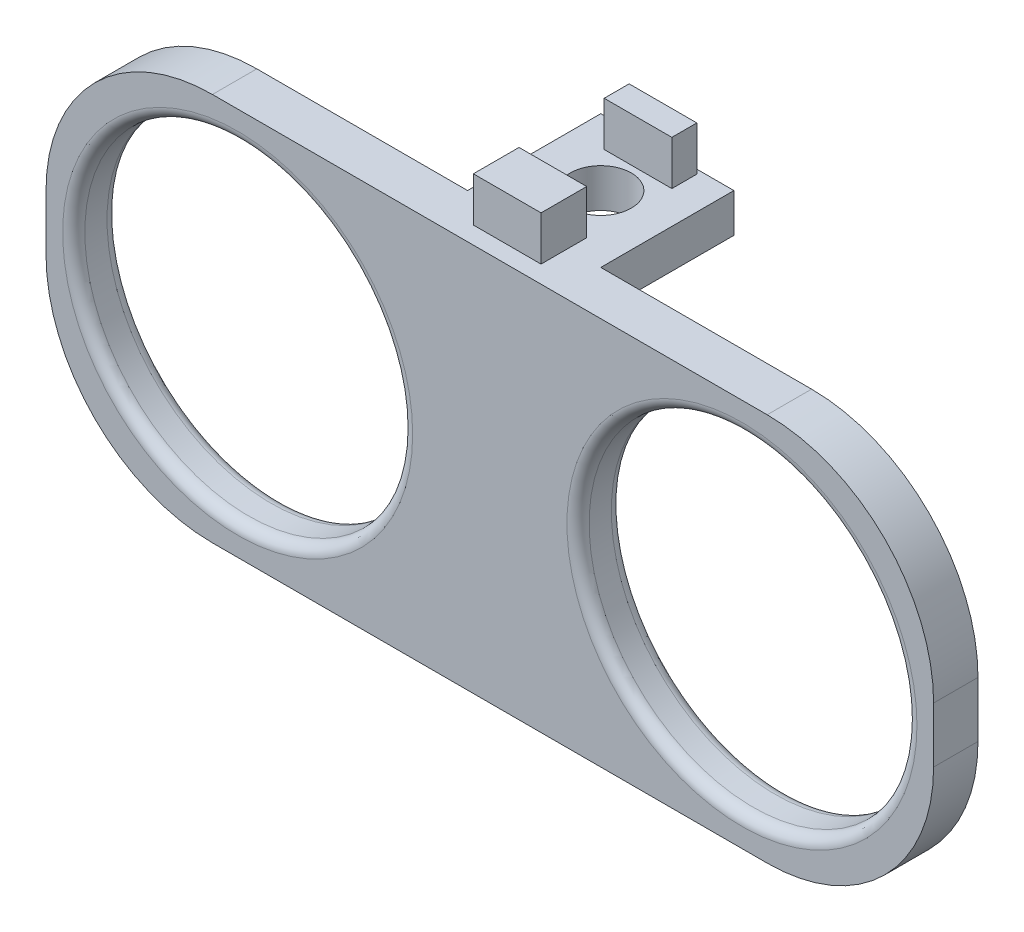
ISO-10303-21;
HEADER;
FILE_DESCRIPTION(('STEP AP214'),'2;1');
FILE_NAME('part.step','',(''),(''),'','','');
FILE_SCHEMA(('AUTOMOTIVE_DESIGN { 1 0 10303 214 1 1 1 1 }'));
ENDSEC;
DATA;
#1=APPLICATION_CONTEXT('core data for automotive mechanical design processes');
#2=APPLICATION_PROTOCOL_DEFINITION('international standard','automotive_design',2000,#1);
#3=PRODUCT_CONTEXT('',#1,'mechanical');
#4=PRODUCT('Part','Part','',(#3));
#5=PRODUCT_RELATED_PRODUCT_CATEGORY('part','',(#4));
#6=PRODUCT_DEFINITION_FORMATION('','',#4);
#7=PRODUCT_DEFINITION_CONTEXT('part definition',#1,'design');
#8=PRODUCT_DEFINITION('design','',#6,#7);
#9=PRODUCT_DEFINITION_SHAPE('','',#8);
#10=(LENGTH_UNIT() NAMED_UNIT(*) SI_UNIT(.MILLI.,.METRE.));
#11=(NAMED_UNIT(*) PLANE_ANGLE_UNIT() SI_UNIT($,.RADIAN.));
#12=(NAMED_UNIT(*) SI_UNIT($,.STERADIAN.) SOLID_ANGLE_UNIT());
#13=UNCERTAINTY_MEASURE_WITH_UNIT(LENGTH_MEASURE(1.E-05),#10,'distance_accuracy_value','');
#14=(GEOMETRIC_REPRESENTATION_CONTEXT(3) GLOBAL_UNCERTAINTY_ASSIGNED_CONTEXT((#13)) GLOBAL_UNIT_ASSIGNED_CONTEXT((#10,
#11,#12)) REPRESENTATION_CONTEXT('',''));
#15=CARTESIAN_POINT('',(0.,0.,0.));
#16=DIRECTION('',(0.,0.,1.));
#17=DIRECTION('',(1.,0.,0.));
#18=AXIS2_PLACEMENT_3D('',#15,#16,#17);
#19=CARTESIAN_POINT('',(-40.,17.5,4.));
#20=DIRECTION('',(0.,-1.,0.));
#21=DIRECTION('',(0.,0.,-1.));
#22=AXIS2_PLACEMENT_3D('',#19,#20,#21);
#23=PLANE('',#22);
#24=DIRECTION('',(0.,0.,-1.));
#25=VECTOR('',#24,1.);
#26=CARTESIAN_POINT('',(3.05000000000001,17.5,-11.6081021809578));
#27=LINE('',#26,#25);
#28=CARTESIAN_POINT('',(3.05000000000001,17.5,-9.35778156326705));
#29=VERTEX_POINT('',#28);
#30=CARTESIAN_POINT('',(3.05,17.5,-11.6081021809578));
#31=VERTEX_POINT('',#30);
#32=EDGE_CURVE('E204',#29,#31,#27,.T.);
#33=ORIENTED_EDGE('',*,*,#32,.F.);
#34=DIRECTION('',(1.,0.,0.));
#35=VECTOR('',#34,1.);
#36=CARTESIAN_POINT('',(-3.04999999999999,17.5,-9.35778156326705));
#37=LINE('',#36,#35);
#38=CARTESIAN_POINT('',(-3.04999999999999,17.5,-9.35778156326705));
#39=VERTEX_POINT('',#38);
#40=EDGE_CURVE('E220',#39,#29,#37,.T.);
#41=ORIENTED_EDGE('',*,*,#40,.F.);
#42=DIRECTION('',(0.,0.,1.));
#43=VECTOR('',#42,1.);
#44=CARTESIAN_POINT('',(-3.04999999999999,17.5,-11.6081021809578));
#45=LINE('',#44,#43);
#46=CARTESIAN_POINT('',(-3.04999999999999,17.5,-11.6081021809578));
#47=VERTEX_POINT('',#46);
#48=EDGE_CURVE('E233',#47,#39,#45,.T.);
#49=ORIENTED_EDGE('',*,*,#48,.F.);
#50=DIRECTION('',(-1.,0.,0.));
#51=VECTOR('',#50,1.);
#52=CARTESIAN_POINT('',(-3.04999999999999,17.5,-11.6081021809578));
#53=LINE('',#52,#51);
#54=EDGE_CURVE('E209',#31,#47,#53,.T.);
#55=ORIENTED_EDGE('',*,*,#54,.F.);
#56=EDGE_LOOP('',(#33,#41,#49,#55));
#57=FACE_BOUND('',#56,.T.);
#58=CARTESIAN_POINT('',(0.,17.5,-6.));
#59=DIRECTION('',(0.,-1.,0.));
#60=DIRECTION('',(0.,0.,-1.));
#61=AXIS2_PLACEMENT_3D('',#58,#59,#60);
#62=CIRCLE('',#61,2.75);
#63=CARTESIAN_POINT('',(0.,17.5,-8.75));
#64=VERTEX_POINT('',#63);
#65=EDGE_CURVE('E259',#64,#64,#62,.T.);
#66=ORIENTED_EDGE('',*,*,#65,.T.);
#67=EDGE_LOOP('',(#66));
#68=FACE_BOUND('',#67,.T.);
#69=DIRECTION('',(-1.,0.,0.));
#70=VECTOR('',#69,1.);
#71=CARTESIAN_POINT('',(-40.,17.5,0.));
#72=LINE('',#71,#70);
#73=CARTESIAN_POINT('',(-6.,17.5,0.));
#74=VERTEX_POINT('',#73);
#75=CARTESIAN_POINT('',(-25.,17.5,0.));
#76=VERTEX_POINT('',#75);
#77=EDGE_CURVE('E326',#74,#76,#72,.T.);
#78=ORIENTED_EDGE('',*,*,#77,.T.);
#79=DIRECTION('',(0.,0.,-1.));
#80=VECTOR('',#79,1.);
#81=CARTESIAN_POINT('',(-25.,17.5,4.));
#82=LINE('',#81,#80);
#83=CARTESIAN_POINT('',(-25.,17.5,4.));
#84=VERTEX_POINT('',#83);
#85=EDGE_CURVE('E409',#76,#84,#82,.F.);
#86=ORIENTED_EDGE('',*,*,#85,.T.);
#87=DIRECTION('',(-1.,0.,0.));
#88=VECTOR('',#87,1.);
#89=CARTESIAN_POINT('',(-40.,17.5,4.));
#90=LINE('',#89,#88);
#91=CARTESIAN_POINT('',(25.,17.5,4.));
#92=VERTEX_POINT('',#91);
#93=EDGE_CURVE('E310',#92,#84,#90,.T.);
#94=ORIENTED_EDGE('',*,*,#93,.F.);
#95=DIRECTION('',(0.,0.,-1.));
#96=VECTOR('',#95,1.);
#97=CARTESIAN_POINT('',(25.,17.5,4.));
#98=LINE('',#97,#96);
#99=CARTESIAN_POINT('',(25.,17.5,0.));
#100=VERTEX_POINT('',#99);
#101=EDGE_CURVE('E405',#92,#100,#98,.T.);
#102=ORIENTED_EDGE('',*,*,#101,.T.);
#103=CARTESIAN_POINT('',(6.00000000000001,17.5,0.));
#104=VERTEX_POINT('',#103);
#105=EDGE_CURVE('E327',#100,#104,#72,.T.);
#106=ORIENTED_EDGE('',*,*,#105,.T.);
#107=DIRECTION('',(0.,0.,1.));
#108=VECTOR('',#107,1.);
#109=CARTESIAN_POINT('',(6.,17.5,-12.));
#110=LINE('',#109,#108);
#111=CARTESIAN_POINT('',(6.,17.5,-12.));
#112=VERTEX_POINT('',#111);
#113=EDGE_CURVE('E293',#112,#104,#110,.T.);
#114=ORIENTED_EDGE('',*,*,#113,.F.);
#115=DIRECTION('',(1.,0.,0.));
#116=VECTOR('',#115,1.);
#117=CARTESIAN_POINT('',(0.,17.5,-12.));
#118=LINE('',#117,#116);
#119=CARTESIAN_POINT('',(-6.,17.5,-12.));
#120=VERTEX_POINT('',#119);
#121=EDGE_CURVE('E272',#120,#112,#118,.T.);
#122=ORIENTED_EDGE('',*,*,#121,.F.);
#123=DIRECTION('',(0.,0.,1.));
#124=VECTOR('',#123,1.);
#125=CARTESIAN_POINT('',(-6.,17.5,-12.));
#126=LINE('',#125,#124);
#127=EDGE_CURVE('E297',#120,#74,#126,.T.);
#128=ORIENTED_EDGE('',*,*,#127,.T.);
#129=EDGE_LOOP('',(#78,#86,#94,#102,#106,#114,#122,#128));
#130=FACE_BOUND('',#129,.T.);
#131=DIRECTION('',(0.,0.,-1.));
#132=VECTOR('',#131,1.);
#133=CARTESIAN_POINT('',(3.05,17.5,-1.682352992912));
#134=LINE('',#133,#132);
#135=CARTESIAN_POINT('',(3.05,17.5,2.432352992912));
#136=VERTEX_POINT('',#135);
#137=CARTESIAN_POINT('',(3.05,17.5,-1.682352992912));
#138=VERTEX_POINT('',#137);
#139=EDGE_CURVE('E202',#136,#138,#134,.T.);
#140=ORIENTED_EDGE('',*,*,#139,.F.);
#141=DIRECTION('',(1.,0.,0.));
#142=VECTOR('',#141,1.);
#143=CARTESIAN_POINT('',(-3.05,17.5,2.432352992912));
#144=LINE('',#143,#142);
#145=CARTESIAN_POINT('',(-3.05,17.5,2.432352992912));
#146=VERTEX_POINT('',#145);
#147=EDGE_CURVE('E199',#146,#136,#144,.T.);
#148=ORIENTED_EDGE('',*,*,#147,.F.);
#149=DIRECTION('',(0.,0.,1.));
#150=VECTOR('',#149,1.);
#151=CARTESIAN_POINT('',(-3.05,17.5,-1.682352992912));
#152=LINE('',#151,#150);
#153=CARTESIAN_POINT('',(-3.05,17.5,-1.682352992912));
#154=VERTEX_POINT('',#153);
#155=EDGE_CURVE('E64',#154,#146,#152,.T.);
#156=ORIENTED_EDGE('',*,*,#155,.F.);
#157=DIRECTION('',(-1.,0.,0.));
#158=VECTOR('',#157,1.);
#159=CARTESIAN_POINT('',(-3.05,17.5,-1.682352992912));
#160=LINE('',#159,#158);
#161=EDGE_CURVE('E59',#138,#154,#160,.T.);
#162=ORIENTED_EDGE('',*,*,#161,.F.);
#163=EDGE_LOOP('',(#140,#148,#156,#162));
#164=FACE_BOUND('',#163,.T.);
#165=ADVANCED_FACE('F43',(#57,#68,#130,#164),#23,.F.);
#166=CARTESIAN_POINT('',(40.,17.5,4.));
#167=DIRECTION('',(-1.,0.,0.));
#168=DIRECTION('',(0.,-1.,0.));
#169=AXIS2_PLACEMENT_3D('',#166,#167,#168);
#170=PLANE('',#169);
#171=DIRECTION('',(0.,1.,0.));
#172=VECTOR('',#171,1.);
#173=CARTESIAN_POINT('',(40.,17.5,0.));
#174=LINE('',#173,#172);
#175=CARTESIAN_POINT('',(40.,-2.5,0.));
#176=VERTEX_POINT('',#175);
#177=CARTESIAN_POINT('',(40.,2.5,0.));
#178=VERTEX_POINT('',#177);
#179=EDGE_CURVE('E305',#176,#178,#174,.T.);
#180=ORIENTED_EDGE('',*,*,#179,.T.);
#181=DIRECTION('',(0.,0.,-1.));
#182=VECTOR('',#181,1.);
#183=CARTESIAN_POINT('',(40.,2.5,4.));
#184=LINE('',#183,#182);
#185=CARTESIAN_POINT('',(40.,2.5,4.));
#186=VERTEX_POINT('',#185);
#187=EDGE_CURVE('E11',#178,#186,#184,.F.);
#188=ORIENTED_EDGE('',*,*,#187,.T.);
#189=DIRECTION('',(0.,1.,0.));
#190=VECTOR('',#189,1.);
#191=CARTESIAN_POINT('',(40.,17.5,4.));
#192=LINE('',#191,#190);
#193=CARTESIAN_POINT('',(40.,-2.5,4.));
#194=VERTEX_POINT('',#193);
#195=EDGE_CURVE('E306',#194,#186,#192,.T.);
#196=ORIENTED_EDGE('',*,*,#195,.F.);
#197=DIRECTION('',(0.,0.,-1.));
#198=VECTOR('',#197,1.);
#199=CARTESIAN_POINT('',(40.,-2.5,4.));
#200=LINE('',#199,#198);
#201=EDGE_CURVE('E359',#194,#176,#200,.T.);
#202=ORIENTED_EDGE('',*,*,#201,.T.);
#203=EDGE_LOOP('',(#180,#188,#196,#202));
#204=FACE_BOUND('',#203,.T.);
#205=ADVANCED_FACE('F453',(#204),#170,.F.);
#206=CARTESIAN_POINT('',(-40.,17.5,4.));
#207=DIRECTION('',(1.,0.,0.));
#208=DIRECTION('',(0.,1.,0.));
#209=AXIS2_PLACEMENT_3D('',#206,#207,#208);
#210=PLANE('',#209);
#211=DIRECTION('',(0.,-1.,0.));
#212=VECTOR('',#211,1.);
#213=CARTESIAN_POINT('',(-40.,17.5,4.));
#214=LINE('',#213,#212);
#215=CARTESIAN_POINT('',(-40.,2.5,4.));
#216=VERTEX_POINT('',#215);
#217=CARTESIAN_POINT('',(-40.,-2.50000000000001,4.));
#218=VERTEX_POINT('',#217);
#219=EDGE_CURVE('E315',#216,#218,#214,.T.);
#220=ORIENTED_EDGE('',*,*,#219,.F.);
#221=DIRECTION('',(0.,0.,-1.));
#222=VECTOR('',#221,1.);
#223=CARTESIAN_POINT('',(-40.,2.5,4.));
#224=LINE('',#223,#222);
#225=CARTESIAN_POINT('',(-40.,2.5,0.));
#226=VERTEX_POINT('',#225);
#227=EDGE_CURVE('E395',#216,#226,#224,.T.);
#228=ORIENTED_EDGE('',*,*,#227,.T.);
#229=DIRECTION('',(0.,-1.,0.));
#230=VECTOR('',#229,1.);
#231=CARTESIAN_POINT('',(-40.,17.5,0.));
#232=LINE('',#231,#230);
#233=CARTESIAN_POINT('',(-40.,-2.50000000000001,0.));
#234=VERTEX_POINT('',#233);
#235=EDGE_CURVE('E330',#226,#234,#232,.T.);
#236=ORIENTED_EDGE('',*,*,#235,.T.);
#237=DIRECTION('',(0.,0.,-1.));
#238=VECTOR('',#237,1.);
#239=CARTESIAN_POINT('',(-40.,-2.50000000000001,4.));
#240=LINE('',#239,#238);
#241=EDGE_CURVE('E349',#234,#218,#240,.F.);
#242=ORIENTED_EDGE('',*,*,#241,.T.);
#243=EDGE_LOOP('',(#220,#228,#236,#242));
#244=FACE_BOUND('',#243,.T.);
#245=ADVANCED_FACE('F424',(#244),#210,.F.);
#246=CARTESIAN_POINT('',(-40.,-17.5,4.));
#247=DIRECTION('',(0.,1.,0.));
#248=DIRECTION('',(0.,0.,1.));
#249=AXIS2_PLACEMENT_3D('',#246,#247,#248);
#250=PLANE('',#249);
#251=DIRECTION('',(1.,0.,0.));
#252=VECTOR('',#251,1.);
#253=CARTESIAN_POINT('',(-40.,-17.5,4.));
#254=LINE('',#253,#252);
#255=CARTESIAN_POINT('',(-25.,-17.5,4.));
#256=VERTEX_POINT('',#255);
#257=CARTESIAN_POINT('',(25.,-17.5,4.));
#258=VERTEX_POINT('',#257);
#259=EDGE_CURVE('E318',#256,#258,#254,.T.);
#260=ORIENTED_EDGE('',*,*,#259,.F.);
#261=DIRECTION('',(0.,0.,-1.));
#262=VECTOR('',#261,1.);
#263=CARTESIAN_POINT('',(-25.,-17.5,4.));
#264=LINE('',#263,#262);
#265=CARTESIAN_POINT('',(-25.,-17.5,0.));
#266=VERTEX_POINT('',#265);
#267=EDGE_CURVE('E338',#256,#266,#264,.T.);
#268=ORIENTED_EDGE('',*,*,#267,.T.);
#269=DIRECTION('',(1.,0.,0.));
#270=VECTOR('',#269,1.);
#271=CARTESIAN_POINT('',(-40.,-17.5,0.));
#272=LINE('',#271,#270);
#273=CARTESIAN_POINT('',(25.,-17.5,0.));
#274=VERTEX_POINT('',#273);
#275=EDGE_CURVE('E311',#266,#274,#272,.T.);
#276=ORIENTED_EDGE('',*,*,#275,.T.);
#277=DIRECTION('',(0.,0.,-1.));
#278=VECTOR('',#277,1.);
#279=CARTESIAN_POINT('',(25.,-17.5,4.));
#280=LINE('',#279,#278);
#281=EDGE_CURVE('E322',#274,#258,#280,.F.);
#282=ORIENTED_EDGE('',*,*,#281,.T.);
#283=EDGE_LOOP('',(#260,#268,#276,#282));
#284=FACE_BOUND('',#283,.T.);
#285=ADVANCED_FACE('F464',(#284),#250,.F.);
#286=CARTESIAN_POINT('',(0.,0.,4.));
#287=DIRECTION('',(0.,0.,1.));
#288=DIRECTION('',(1.,0.,0.));
#289=AXIS2_PLACEMENT_3D('',#286,#287,#288);
#290=PLANE('',#289);
#291=CARTESIAN_POINT('',(-22.725,0.,4.));
#292=DIRECTION('',(0.,0.,1.));
#293=DIRECTION('',(1.,0.,0.));
#294=AXIS2_PLACEMENT_3D('',#291,#292,#293);
#295=CIRCLE('',#294,15.775);
#296=CARTESIAN_POINT('',(-6.95000000000001,0.,4.));
#297=VERTEX_POINT('',#296);
#298=EDGE_CURVE('E379',#297,#297,#295,.F.);
#299=ORIENTED_EDGE('',*,*,#298,.T.);
#300=EDGE_LOOP('',(#299));
#301=FACE_BOUND('',#300,.T.);
#302=CARTESIAN_POINT('',(22.725,0.,4.));
#303=DIRECTION('',(0.,0.,1.));
#304=DIRECTION('',(1.,0.,0.));
#305=AXIS2_PLACEMENT_3D('',#302,#303,#304);
#306=CIRCLE('',#305,15.775);
#307=CARTESIAN_POINT('',(38.5,0.,4.));
#308=VERTEX_POINT('',#307);
#309=EDGE_CURVE('E371',#308,#308,#306,.F.);
#310=ORIENTED_EDGE('',*,*,#309,.T.);
#311=EDGE_LOOP('',(#310));
#312=FACE_BOUND('',#311,.T.);
#313=ORIENTED_EDGE('',*,*,#93,.T.);
#314=CARTESIAN_POINT('',(-25.,2.5,4.));
#315=DIRECTION('',(0.,0.,1.));
#316=DIRECTION('',(1.,0.,0.));
#317=AXIS2_PLACEMENT_3D('',#314,#315,#316);
#318=CIRCLE('',#317,15.);
#319=EDGE_CURVE('E52',#84,#216,#318,.T.);
#320=ORIENTED_EDGE('',*,*,#319,.T.);
#321=ORIENTED_EDGE('',*,*,#219,.T.);
#322=CARTESIAN_POINT('',(-25.,-2.50000000000001,4.));
#323=DIRECTION('',(0.,0.,1.));
#324=DIRECTION('',(1.,0.,0.));
#325=AXIS2_PLACEMENT_3D('',#322,#323,#324);
#326=CIRCLE('',#325,15.);
#327=EDGE_CURVE('E356',#218,#256,#326,.T.);
#328=ORIENTED_EDGE('',*,*,#327,.T.);
#329=ORIENTED_EDGE('',*,*,#259,.T.);
#330=CARTESIAN_POINT('',(25.,-2.50000000000001,4.));
#331=DIRECTION('',(0.,0.,1.));
#332=DIRECTION('',(1.,0.,0.));
#333=AXIS2_PLACEMENT_3D('',#330,#331,#332);
#334=CIRCLE('',#333,15.);
#335=EDGE_CURVE('E353',#258,#194,#334,.T.);
#336=ORIENTED_EDGE('',*,*,#335,.T.);
#337=ORIENTED_EDGE('',*,*,#195,.T.);
#338=CARTESIAN_POINT('',(25.,2.5,4.));
#339=DIRECTION('',(0.,0.,1.));
#340=DIRECTION('',(1.,0.,0.));
#341=AXIS2_PLACEMENT_3D('',#338,#339,#340);
#342=CIRCLE('',#341,15.);
#343=EDGE_CURVE('E412',#186,#92,#342,.T.);
#344=ORIENTED_EDGE('',*,*,#343,.T.);
#345=EDGE_LOOP('',(#313,#320,#321,#328,#329,#336,#337,#344));
#346=FACE_BOUND('',#345,.T.);
#347=ADVANCED_FACE('F418',(#301,#312,#346),#290,.T.);
#348=CARTESIAN_POINT('',(0.,0.,0.));
#349=DIRECTION('',(0.,0.,1.));
#350=DIRECTION('',(1.,0.,0.));
#351=AXIS2_PLACEMENT_3D('',#348,#349,#350);
#352=PLANE('',#351);
#353=CARTESIAN_POINT('',(-22.725,0.,0.));
#354=DIRECTION('',(0.,0.,1.));
#355=DIRECTION('',(1.,0.,0.));
#356=AXIS2_PLACEMENT_3D('',#353,#354,#355);
#357=CIRCLE('',#356,15.775);
#358=CARTESIAN_POINT('',(-6.95000000000001,0.,0.));
#359=VERTEX_POINT('',#358);
#360=EDGE_CURVE('E391',#359,#359,#357,.T.);
#361=ORIENTED_EDGE('',*,*,#360,.T.);
#362=EDGE_LOOP('',(#361));
#363=FACE_BOUND('',#362,.T.);
#364=CARTESIAN_POINT('',(22.725,0.,0.));
#365=DIRECTION('',(0.,0.,1.));
#366=DIRECTION('',(1.,0.,0.));
#367=AXIS2_PLACEMENT_3D('',#364,#365,#366);
#368=CIRCLE('',#367,15.775);
#369=CARTESIAN_POINT('',(38.5,0.,0.));
#370=VERTEX_POINT('',#369);
#371=EDGE_CURVE('E375',#370,#370,#368,.T.);
#372=ORIENTED_EDGE('',*,*,#371,.T.);
#373=EDGE_LOOP('',(#372));
#374=FACE_BOUND('',#373,.T.);
#375=ORIENTED_EDGE('',*,*,#235,.F.);
#376=CARTESIAN_POINT('',(-25.,2.5,0.));
#377=DIRECTION('',(0.,0.,1.));
#378=DIRECTION('',(1.,0.,0.));
#379=AXIS2_PLACEMENT_3D('',#376,#377,#378);
#380=CIRCLE('',#379,15.);
#381=EDGE_CURVE('E402',#226,#76,#380,.F.);
#382=ORIENTED_EDGE('',*,*,#381,.T.);
#383=ORIENTED_EDGE('',*,*,#77,.F.);
#384=DIRECTION('',(0.,1.,0.));
#385=VECTOR('',#384,1.);
#386=CARTESIAN_POINT('',(-6.,0.,0.));
#387=LINE('',#386,#385);
#388=CARTESIAN_POINT('',(-6.,14.,0.));
#389=VERTEX_POINT('',#388);
#390=EDGE_CURVE('E283',#389,#74,#387,.T.);
#391=ORIENTED_EDGE('',*,*,#390,.F.);
#392=DIRECTION('',(-1.,0.,0.));
#393=VECTOR('',#392,1.);
#394=CARTESIAN_POINT('',(0.,14.,0.));
#395=LINE('',#394,#393);
#396=CARTESIAN_POINT('',(6.,14.,0.));
#397=VERTEX_POINT('',#396);
#398=EDGE_CURVE('E263',#397,#389,#395,.T.);
#399=ORIENTED_EDGE('',*,*,#398,.F.);
#400=DIRECTION('',(0.,1.,0.));
#401=VECTOR('',#400,1.);
#402=CARTESIAN_POINT('',(6.,0.,0.));
#403=LINE('',#402,#401);
#404=EDGE_CURVE('E269',#397,#104,#403,.T.);
#405=ORIENTED_EDGE('',*,*,#404,.T.);
#406=ORIENTED_EDGE('',*,*,#105,.F.);
#407=CARTESIAN_POINT('',(25.,2.5,0.));
#408=DIRECTION('',(0.,0.,1.));
#409=DIRECTION('',(1.,0.,0.));
#410=AXIS2_PLACEMENT_3D('',#407,#408,#409);
#411=CIRCLE('',#410,15.);
#412=EDGE_CURVE('E399',#100,#178,#411,.F.);
#413=ORIENTED_EDGE('',*,*,#412,.T.);
#414=ORIENTED_EDGE('',*,*,#179,.F.);
#415=CARTESIAN_POINT('',(25.,-2.50000000000001,0.));
#416=DIRECTION('',(0.,0.,1.));
#417=DIRECTION('',(1.,0.,0.));
#418=AXIS2_PLACEMENT_3D('',#415,#416,#417);
#419=CIRCLE('',#418,15.);
#420=EDGE_CURVE('E342',#176,#274,#419,.F.);
#421=ORIENTED_EDGE('',*,*,#420,.T.);
#422=ORIENTED_EDGE('',*,*,#275,.F.);
#423=CARTESIAN_POINT('',(-25.,-2.50000000000001,0.));
#424=DIRECTION('',(0.,0.,1.));
#425=DIRECTION('',(1.,0.,0.));
#426=AXIS2_PLACEMENT_3D('',#423,#424,#425);
#427=CIRCLE('',#426,15.);
#428=EDGE_CURVE('E345',#266,#234,#427,.F.);
#429=ORIENTED_EDGE('',*,*,#428,.T.);
#430=EDGE_LOOP('',(#375,#382,#383,#391,#399,#405,#406,#413,#414,#421,#422,#429));
#431=FACE_BOUND('',#430,.T.);
#432=ADVANCED_FACE('F431',(#363,#374,#431),#352,.F.);
#433=CARTESIAN_POINT('',(22.725,0.,0.));
#434=DIRECTION('',(0.,0.,1.));
#435=DIRECTION('',(1.,0.,0.));
#436=AXIS2_PLACEMENT_3D('',#433,#434,#435);
#437=CYLINDRICAL_SURFACE('',#436,14.775);
#438=CARTESIAN_POINT('',(22.725,0.,3.));
#439=DIRECTION('',(0.,0.,1.));
#440=DIRECTION('',(1.,0.,0.));
#441=AXIS2_PLACEMENT_3D('',#438,#439,#440);
#442=CIRCLE('',#441,14.775);
#443=CARTESIAN_POINT('',(37.5,0.,3.));
#444=VERTEX_POINT('',#443);
#445=EDGE_CURVE('E367',#444,#444,#442,.T.);
#446=ORIENTED_EDGE('',*,*,#445,.T.);
#447=EDGE_LOOP('',(#446));
#448=FACE_BOUND('',#447,.T.);
#449=CARTESIAN_POINT('',(22.725,0.,1.));
#450=DIRECTION('',(0.,0.,1.));
#451=DIRECTION('',(1.,0.,0.));
#452=AXIS2_PLACEMENT_3D('',#449,#450,#451);
#453=CIRCLE('',#452,14.775);
#454=CARTESIAN_POINT('',(37.5,0.,1.));
#455=VERTEX_POINT('',#454);
#456=EDGE_CURVE('E363',#455,#455,#453,.F.);
#457=ORIENTED_EDGE('',*,*,#456,.T.);
#458=EDGE_LOOP('',(#457));
#459=FACE_BOUND('',#458,.T.);
#460=ADVANCED_FACE('F469',(#448,#459),#437,.F.);
#461=CARTESIAN_POINT('',(-25.,-2.50000000000001,4.));
#462=DIRECTION('',(0.,0.,-1.));
#463=DIRECTION('',(-1.,0.,0.));
#464=AXIS2_PLACEMENT_3D('',#461,#462,#463);
#465=CYLINDRICAL_SURFACE('',#464,15.);
#466=ORIENTED_EDGE('',*,*,#327,.F.);
#467=ORIENTED_EDGE('',*,*,#241,.F.);
#468=ORIENTED_EDGE('',*,*,#428,.F.);
#469=ORIENTED_EDGE('',*,*,#267,.F.);
#470=EDGE_LOOP('',(#466,#467,#468,#469));
#471=FACE_BOUND('',#470,.T.);
#472=ADVANCED_FACE('F467',(#471),#465,.T.);
#473=CARTESIAN_POINT('',(25.,-2.50000000000001,4.));
#474=DIRECTION('',(0.,0.,-1.));
#475=DIRECTION('',(-1.,0.,0.));
#476=AXIS2_PLACEMENT_3D('',#473,#474,#475);
#477=CYLINDRICAL_SURFACE('',#476,15.);
#478=ORIENTED_EDGE('',*,*,#335,.F.);
#479=ORIENTED_EDGE('',*,*,#281,.F.);
#480=ORIENTED_EDGE('',*,*,#420,.F.);
#481=ORIENTED_EDGE('',*,*,#201,.F.);
#482=EDGE_LOOP('',(#478,#479,#480,#481));
#483=FACE_BOUND('',#482,.T.);
#484=ADVANCED_FACE('F459',(#483),#477,.T.);
#485=CARTESIAN_POINT('',(0.,14.,-12.));
#486=DIRECTION('',(0.,1.,0.));
#487=DIRECTION('',(0.,0.,1.));
#488=AXIS2_PLACEMENT_3D('',#485,#486,#487);
#489=PLANE('',#488);
#490=CARTESIAN_POINT('',(0.,14.,-6.));
#491=DIRECTION('',(0.,-1.,0.));
#492=DIRECTION('',(0.,0.,-1.));
#493=AXIS2_PLACEMENT_3D('',#490,#491,#492);
#494=CIRCLE('',#493,2.75);
#495=CARTESIAN_POINT('',(0.,14.,-8.75));
#496=VERTEX_POINT('',#495);
#497=EDGE_CURVE('E255',#496,#496,#494,.T.);
#498=ORIENTED_EDGE('',*,*,#497,.F.);
#499=EDGE_LOOP('',(#498));
#500=FACE_BOUND('',#499,.T.);
#501=ORIENTED_EDGE('',*,*,#398,.T.);
#502=DIRECTION('',(0.,0.,1.));
#503=VECTOR('',#502,1.);
#504=CARTESIAN_POINT('',(-6.,14.,-12.));
#505=LINE('',#504,#503);
#506=CARTESIAN_POINT('',(-6.,14.,-12.));
#507=VERTEX_POINT('',#506);
#508=EDGE_CURVE('E301',#507,#389,#505,.T.);
#509=ORIENTED_EDGE('',*,*,#508,.F.);
#510=DIRECTION('',(-1.,0.,0.));
#511=VECTOR('',#510,1.);
#512=CARTESIAN_POINT('',(0.,14.,-12.));
#513=LINE('',#512,#511);
#514=CARTESIAN_POINT('',(6.,14.,-12.));
#515=VERTEX_POINT('',#514);
#516=EDGE_CURVE('E264',#515,#507,#513,.T.);
#517=ORIENTED_EDGE('',*,*,#516,.F.);
#518=DIRECTION('',(0.,0.,1.));
#519=VECTOR('',#518,1.);
#520=CARTESIAN_POINT('',(6.,14.,-12.));
#521=LINE('',#520,#519);
#522=EDGE_CURVE('E279',#515,#397,#521,.T.);
#523=ORIENTED_EDGE('',*,*,#522,.T.);
#524=EDGE_LOOP('',(#501,#509,#517,#523));
#525=FACE_BOUND('',#524,.T.);
#526=ADVANCED_FACE('F444',(#500,#525),#489,.F.);
#527=CARTESIAN_POINT('',(-6.,0.,-12.));
#528=DIRECTION('',(1.,0.,0.));
#529=DIRECTION('',(0.,0.,-1.));
#530=AXIS2_PLACEMENT_3D('',#527,#528,#529);
#531=PLANE('',#530);
#532=ORIENTED_EDGE('',*,*,#390,.T.);
#533=ORIENTED_EDGE('',*,*,#127,.F.);
#534=DIRECTION('',(0.,1.,0.));
#535=VECTOR('',#534,1.);
#536=CARTESIAN_POINT('',(-6.,0.,-12.));
#537=LINE('',#536,#535);
#538=EDGE_CURVE('E268',#507,#120,#537,.T.);
#539=ORIENTED_EDGE('',*,*,#538,.F.);
#540=ORIENTED_EDGE('',*,*,#508,.T.);
#541=EDGE_LOOP('',(#532,#533,#539,#540));
#542=FACE_BOUND('',#541,.T.);
#543=ADVANCED_FACE('F438',(#542),#531,.F.);
#544=CARTESIAN_POINT('',(6.,0.,-12.));
#545=DIRECTION('',(1.,0.,0.));
#546=DIRECTION('',(0.,0.,-1.));
#547=AXIS2_PLACEMENT_3D('',#544,#545,#546);
#548=PLANE('',#547);
#549=ORIENTED_EDGE('',*,*,#404,.F.);
#550=ORIENTED_EDGE('',*,*,#522,.F.);
#551=DIRECTION('',(0.,1.,0.));
#552=VECTOR('',#551,1.);
#553=CARTESIAN_POINT('',(6.,0.,-12.));
#554=LINE('',#553,#552);
#555=EDGE_CURVE('E275',#515,#112,#554,.T.);
#556=ORIENTED_EDGE('',*,*,#555,.T.);
#557=ORIENTED_EDGE('',*,*,#113,.T.);
#558=EDGE_LOOP('',(#549,#550,#556,#557));
#559=FACE_BOUND('',#558,.T.);
#560=ADVANCED_FACE('F447',(#559),#548,.T.);
#561=CARTESIAN_POINT('',(0.,0.,-12.));
#562=DIRECTION('',(0.,0.,-1.));
#563=DIRECTION('',(-1.,0.,0.));
#564=AXIS2_PLACEMENT_3D('',#561,#562,#563);
#565=PLANE('',#564);
#566=ORIENTED_EDGE('',*,*,#516,.T.);
#567=ORIENTED_EDGE('',*,*,#538,.T.);
#568=ORIENTED_EDGE('',*,*,#121,.T.);
#569=ORIENTED_EDGE('',*,*,#555,.F.);
#570=EDGE_LOOP('',(#566,#567,#568,#569));
#571=FACE_BOUND('',#570,.T.);
#572=ADVANCED_FACE('F504',(#571),#565,.T.);
#573=CARTESIAN_POINT('',(0.,19.,-6.));
#574=DIRECTION('',(0.,-1.,0.));
#575=DIRECTION('',(0.,0.,-1.));
#576=AXIS2_PLACEMENT_3D('',#573,#574,#575);
#577=CYLINDRICAL_SURFACE('',#576,2.75);
#578=ORIENTED_EDGE('',*,*,#497,.T.);
#579=EDGE_LOOP('',(#578));
#580=FACE_BOUND('',#579,.T.);
#581=ORIENTED_EDGE('',*,*,#65,.F.);
#582=EDGE_LOOP('',(#581));
#583=FACE_BOUND('',#582,.T.);
#584=ADVANCED_FACE('F507',(#580,#583),#577,.F.);
#585=CARTESIAN_POINT('',(22.725,0.,3.));
#586=DIRECTION('',(0.,0.,1.));
#587=DIRECTION('',(1.,0.,0.));
#588=AXIS2_PLACEMENT_3D('',#585,#586,#587);
#589=TOROIDAL_SURFACE('',#588,15.775,1.);
#590=ORIENTED_EDGE('',*,*,#309,.F.);
#591=EDGE_LOOP('',(#590));
#592=FACE_BOUND('',#591,.T.);
#593=ORIENTED_EDGE('',*,*,#445,.F.);
#594=EDGE_LOOP('',(#593));
#595=FACE_BOUND('',#594,.T.);
#596=ADVANCED_FACE('F511',(#592,#595),#589,.T.);
#597=CARTESIAN_POINT('',(22.725,0.,1.));
#598=DIRECTION('',(0.,0.,1.));
#599=DIRECTION('',(1.,0.,0.));
#600=AXIS2_PLACEMENT_3D('',#597,#598,#599);
#601=TOROIDAL_SURFACE('',#600,15.775,1.);
#602=ORIENTED_EDGE('',*,*,#456,.F.);
#603=EDGE_LOOP('',(#602));
#604=FACE_BOUND('',#603,.T.);
#605=ORIENTED_EDGE('',*,*,#371,.F.);
#606=EDGE_LOOP('',(#605));
#607=FACE_BOUND('',#606,.T.);
#608=ADVANCED_FACE('F517',(#604,#607),#601,.T.);
#609=CARTESIAN_POINT('',(-22.725,0.,0.));
#610=DIRECTION('',(0.,0.,1.));
#611=DIRECTION('',(1.,0.,0.));
#612=AXIS2_PLACEMENT_3D('',#609,#610,#611);
#613=CYLINDRICAL_SURFACE('',#612,14.775);
#614=CARTESIAN_POINT('',(-22.725,0.,3.));
#615=DIRECTION('',(0.,0.,1.));
#616=DIRECTION('',(1.,0.,0.));
#617=AXIS2_PLACEMENT_3D('',#614,#615,#616);
#618=CIRCLE('',#617,14.775);
#619=CARTESIAN_POINT('',(-7.95000000000001,0.,3.));
#620=VERTEX_POINT('',#619);
#621=EDGE_CURVE('E387',#620,#620,#618,.T.);
#622=ORIENTED_EDGE('',*,*,#621,.T.);
#623=EDGE_LOOP('',(#622));
#624=FACE_BOUND('',#623,.T.);
#625=CARTESIAN_POINT('',(-22.725,0.,1.));
#626=DIRECTION('',(0.,0.,1.));
#627=DIRECTION('',(1.,0.,0.));
#628=AXIS2_PLACEMENT_3D('',#625,#626,#627);
#629=CIRCLE('',#628,14.775);
#630=CARTESIAN_POINT('',(-7.95000000000001,0.,1.));
#631=VERTEX_POINT('',#630);
#632=EDGE_CURVE('E383',#631,#631,#629,.F.);
#633=ORIENTED_EDGE('',*,*,#632,.T.);
#634=EDGE_LOOP('',(#633));
#635=FACE_BOUND('',#634,.T.);
#636=ADVANCED_FACE('F513',(#624,#635),#613,.F.);
#637=CARTESIAN_POINT('',(-22.725,0.,3.));
#638=DIRECTION('',(0.,0.,1.));
#639=DIRECTION('',(1.,0.,0.));
#640=AXIS2_PLACEMENT_3D('',#637,#638,#639);
#641=TOROIDAL_SURFACE('',#640,15.775,1.);
#642=ORIENTED_EDGE('',*,*,#621,.F.);
#643=EDGE_LOOP('',(#642));
#644=FACE_BOUND('',#643,.T.);
#645=ORIENTED_EDGE('',*,*,#298,.F.);
#646=EDGE_LOOP('',(#645));
#647=FACE_BOUND('',#646,.T.);
#648=ADVANCED_FACE('F516',(#644,#647),#641,.T.);
#649=CARTESIAN_POINT('',(-22.725,0.,1.));
#650=DIRECTION('',(0.,0.,1.));
#651=DIRECTION('',(1.,0.,0.));
#652=AXIS2_PLACEMENT_3D('',#649,#650,#651);
#653=TOROIDAL_SURFACE('',#652,15.775,1.);
#654=ORIENTED_EDGE('',*,*,#360,.F.);
#655=EDGE_LOOP('',(#654));
#656=FACE_BOUND('',#655,.T.);
#657=ORIENTED_EDGE('',*,*,#632,.F.);
#658=EDGE_LOOP('',(#657));
#659=FACE_BOUND('',#658,.T.);
#660=ADVANCED_FACE('F590',(#656,#659),#653,.T.);
#661=CARTESIAN_POINT('',(-25.,2.5,4.));
#662=DIRECTION('',(0.,0.,-1.));
#663=DIRECTION('',(-1.,0.,0.));
#664=AXIS2_PLACEMENT_3D('',#661,#662,#663);
#665=CYLINDRICAL_SURFACE('',#664,15.);
#666=ORIENTED_EDGE('',*,*,#319,.F.);
#667=ORIENTED_EDGE('',*,*,#85,.F.);
#668=ORIENTED_EDGE('',*,*,#381,.F.);
#669=ORIENTED_EDGE('',*,*,#227,.F.);
#670=EDGE_LOOP('',(#666,#667,#668,#669));
#671=FACE_BOUND('',#670,.T.);
#672=ADVANCED_FACE('F428',(#671),#665,.T.);
#673=CARTESIAN_POINT('',(25.,2.5,4.));
#674=DIRECTION('',(0.,0.,-1.));
#675=DIRECTION('',(-1.,0.,0.));
#676=AXIS2_PLACEMENT_3D('',#673,#674,#675);
#677=CYLINDRICAL_SURFACE('',#676,15.);
#678=ORIENTED_EDGE('',*,*,#343,.F.);
#679=ORIENTED_EDGE('',*,*,#187,.F.);
#680=ORIENTED_EDGE('',*,*,#412,.F.);
#681=ORIENTED_EDGE('',*,*,#101,.F.);
#682=EDGE_LOOP('',(#678,#679,#680,#681));
#683=FACE_BOUND('',#682,.T.);
#684=ADVANCED_FACE('F45',(#683),#677,.T.);
#685=CARTESIAN_POINT('',(3.05000000000001,21.5,-11.6081021809578));
#686=DIRECTION('',(-1.,0.,0.));
#687=DIRECTION('',(0.,0.,1.));
#688=AXIS2_PLACEMENT_3D('',#685,#686,#687);
#689=PLANE('',#688);
#690=ORIENTED_EDGE('',*,*,#32,.T.);
#691=DIRECTION('',(0.,-1.,0.));
#692=VECTOR('',#691,1.);
#693=CARTESIAN_POINT('',(3.05000000000001,21.5,-11.6081021809578));
#694=LINE('',#693,#692);
#695=CARTESIAN_POINT('',(3.05000000000001,21.5,-11.6081021809578));
#696=VERTEX_POINT('',#695);
#697=EDGE_CURVE('E251',#696,#31,#694,.T.);
#698=ORIENTED_EDGE('',*,*,#697,.F.);
#699=DIRECTION('',(0.,0.,-1.));
#700=VECTOR('',#699,1.);
#701=CARTESIAN_POINT('',(3.05000000000001,21.5,-11.6081021809578));
#702=LINE('',#701,#700);
#703=CARTESIAN_POINT('',(3.05000000000001,21.5,-9.35778156326705));
#704=VERTEX_POINT('',#703);
#705=EDGE_CURVE('E215',#704,#696,#702,.T.);
#706=ORIENTED_EDGE('',*,*,#705,.F.);
#707=DIRECTION('',(0.,-1.,0.));
#708=VECTOR('',#707,1.);
#709=CARTESIAN_POINT('',(3.05000000000001,21.5,-9.35778156326705));
#710=LINE('',#709,#708);
#711=EDGE_CURVE('E228',#704,#29,#710,.T.);
#712=ORIENTED_EDGE('',*,*,#711,.T.);
#713=EDGE_LOOP('',(#690,#698,#706,#712));
#714=FACE_BOUND('',#713,.T.);
#715=ADVANCED_FACE('F519',(#714),#689,.F.);
#716=CARTESIAN_POINT('',(-3.04999999999999,21.5,-11.6081021809578));
#717=DIRECTION('',(0.,0.,1.));
#718=DIRECTION('',(1.,0.,0.));
#719=AXIS2_PLACEMENT_3D('',#716,#717,#718);
#720=PLANE('',#719);
#721=ORIENTED_EDGE('',*,*,#54,.T.);
#722=DIRECTION('',(0.,-1.,0.));
#723=VECTOR('',#722,1.);
#724=CARTESIAN_POINT('',(-3.04999999999999,21.5,-11.6081021809578));
#725=LINE('',#724,#723);
#726=CARTESIAN_POINT('',(-3.04999999999999,21.5,-11.6081021809578));
#727=VERTEX_POINT('',#726);
#728=EDGE_CURVE('E247',#727,#47,#725,.T.);
#729=ORIENTED_EDGE('',*,*,#728,.F.);
#730=DIRECTION('',(-1.,0.,0.));
#731=VECTOR('',#730,1.);
#732=CARTESIAN_POINT('',(-3.04999999999999,21.5,-11.6081021809578));
#733=LINE('',#732,#731);
#734=EDGE_CURVE('E219',#696,#727,#733,.T.);
#735=ORIENTED_EDGE('',*,*,#734,.F.);
#736=ORIENTED_EDGE('',*,*,#697,.T.);
#737=EDGE_LOOP('',(#721,#729,#735,#736));
#738=FACE_BOUND('',#737,.T.);
#739=ADVANCED_FACE('F522',(#738),#720,.F.);
#740=CARTESIAN_POINT('',(-3.04999999999999,21.5,-11.6081021809578));
#741=DIRECTION('',(1.,0.,0.));
#742=DIRECTION('',(0.,0.,-1.));
#743=AXIS2_PLACEMENT_3D('',#740,#741,#742);
#744=PLANE('',#743);
#745=ORIENTED_EDGE('',*,*,#48,.T.);
#746=DIRECTION('',(0.,-1.,0.));
#747=VECTOR('',#746,1.);
#748=CARTESIAN_POINT('',(-3.04999999999999,21.5,-9.35778156326705));
#749=LINE('',#748,#747);
#750=CARTESIAN_POINT('',(-3.04999999999999,21.5,-9.35778156326705));
#751=VERTEX_POINT('',#750);
#752=EDGE_CURVE('E243',#751,#39,#749,.T.);
#753=ORIENTED_EDGE('',*,*,#752,.F.);
#754=DIRECTION('',(0.,0.,1.));
#755=VECTOR('',#754,1.);
#756=CARTESIAN_POINT('',(-3.04999999999999,21.5,-11.6081021809578));
#757=LINE('',#756,#755);
#758=EDGE_CURVE('E223',#727,#751,#757,.T.);
#759=ORIENTED_EDGE('',*,*,#758,.F.);
#760=ORIENTED_EDGE('',*,*,#728,.T.);
#761=EDGE_LOOP('',(#745,#753,#759,#760));
#762=FACE_BOUND('',#761,.T.);
#763=ADVANCED_FACE('F526',(#762),#744,.F.);
#764=CARTESIAN_POINT('',(-3.04999999999999,21.5,-9.35778156326705));
#765=DIRECTION('',(0.,0.,-1.));
#766=DIRECTION('',(-1.,0.,0.));
#767=AXIS2_PLACEMENT_3D('',#764,#765,#766);
#768=PLANE('',#767);
#769=ORIENTED_EDGE('',*,*,#40,.T.);
#770=ORIENTED_EDGE('',*,*,#711,.F.);
#771=DIRECTION('',(1.,0.,0.));
#772=VECTOR('',#771,1.);
#773=CARTESIAN_POINT('',(-3.04999999999999,21.5,-9.35778156326705));
#774=LINE('',#773,#772);
#775=EDGE_CURVE('E226',#751,#704,#774,.T.);
#776=ORIENTED_EDGE('',*,*,#775,.F.);
#777=ORIENTED_EDGE('',*,*,#752,.T.);
#778=EDGE_LOOP('',(#769,#770,#776,#777));
#779=FACE_BOUND('',#778,.T.);
#780=ADVANCED_FACE('F530',(#779),#768,.F.);
#781=CARTESIAN_POINT('',(0.,21.5,0.));
#782=DIRECTION('',(0.,1.,0.));
#783=DIRECTION('',(0.,0.,1.));
#784=AXIS2_PLACEMENT_3D('',#781,#782,#783);
#785=PLANE('',#784);
#786=ORIENTED_EDGE('',*,*,#705,.T.);
#787=ORIENTED_EDGE('',*,*,#734,.T.);
#788=ORIENTED_EDGE('',*,*,#758,.T.);
#789=ORIENTED_EDGE('',*,*,#775,.T.);
#790=EDGE_LOOP('',(#786,#787,#788,#789));
#791=FACE_BOUND('',#790,.T.);
#792=ADVANCED_FACE('F534',(#791),#785,.T.);
#793=CARTESIAN_POINT('',(3.05,21.5,-1.682352992912));
#794=DIRECTION('',(-1.,0.,0.));
#795=DIRECTION('',(0.,0.,1.));
#796=AXIS2_PLACEMENT_3D('',#793,#794,#795);
#797=PLANE('',#796);
#798=ORIENTED_EDGE('',*,*,#139,.T.);
#799=DIRECTION('',(0.,-1.,0.));
#800=VECTOR('',#799,1.);
#801=CARTESIAN_POINT('',(3.05,21.5,-1.682352992912));
#802=LINE('',#801,#800);
#803=CARTESIAN_POINT('',(3.05,21.5,-1.682352992912));
#804=VERTEX_POINT('',#803);
#805=EDGE_CURVE('E181',#804,#138,#802,.T.);
#806=ORIENTED_EDGE('',*,*,#805,.F.);
#807=DIRECTION('',(0.,0.,-1.));
#808=VECTOR('',#807,1.);
#809=CARTESIAN_POINT('',(3.05,21.5,-1.682352992912));
#810=LINE('',#809,#808);
#811=CARTESIAN_POINT('',(3.05,21.5,2.432352992912));
#812=VERTEX_POINT('',#811);
#813=EDGE_CURVE('E189',#812,#804,#810,.T.);
#814=ORIENTED_EDGE('',*,*,#813,.F.);
#815=DIRECTION('',(0.,-1.,0.));
#816=VECTOR('',#815,1.);
#817=CARTESIAN_POINT('',(3.05,21.5,2.432352992912));
#818=LINE('',#817,#816);
#819=EDGE_CURVE('E804',#812,#136,#818,.T.);
#820=ORIENTED_EDGE('',*,*,#819,.T.);
#821=EDGE_LOOP('',(#798,#806,#814,#820));
#822=FACE_BOUND('',#821,.T.);
#823=ADVANCED_FACE('F201',(#822),#797,.F.);
#824=CARTESIAN_POINT('',(-3.05,21.5,-1.682352992912));
#825=DIRECTION('',(0.,0.,1.));
#826=DIRECTION('',(1.,0.,0.));
#827=AXIS2_PLACEMENT_3D('',#824,#825,#826);
#828=PLANE('',#827);
#829=ORIENTED_EDGE('',*,*,#161,.T.);
#830=DIRECTION('',(0.,-1.,0.));
#831=VECTOR('',#830,1.);
#832=CARTESIAN_POINT('',(-3.05,21.5,-1.682352992912));
#833=LINE('',#832,#831);
#834=CARTESIAN_POINT('',(-3.05,21.5,-1.682352992912));
#835=VERTEX_POINT('',#834);
#836=EDGE_CURVE('E184',#835,#154,#833,.T.);
#837=ORIENTED_EDGE('',*,*,#836,.F.);
#838=DIRECTION('',(-1.,0.,0.));
#839=VECTOR('',#838,1.);
#840=CARTESIAN_POINT('',(-3.05,21.5,-1.682352992912));
#841=LINE('',#840,#839);
#842=EDGE_CURVE('E177',#804,#835,#841,.T.);
#843=ORIENTED_EDGE('',*,*,#842,.F.);
#844=ORIENTED_EDGE('',*,*,#805,.T.);
#845=EDGE_LOOP('',(#829,#837,#843,#844));
#846=FACE_BOUND('',#845,.T.);
#847=ADVANCED_FACE('F179',(#846),#828,.F.);
#848=CARTESIAN_POINT('',(-3.05,21.5,-1.682352992912));
#849=DIRECTION('',(1.,0.,0.));
#850=DIRECTION('',(0.,0.,-1.));
#851=AXIS2_PLACEMENT_3D('',#848,#849,#850);
#852=PLANE('',#851);
#853=ORIENTED_EDGE('',*,*,#155,.T.);
#854=DIRECTION('',(0.,-1.,0.));
#855=VECTOR('',#854,1.);
#856=CARTESIAN_POINT('',(-3.05,21.5,2.432352992912));
#857=LINE('',#856,#855);
#858=CARTESIAN_POINT('',(-3.05,21.5,2.432352992912));
#859=VERTEX_POINT('',#858);
#860=EDGE_CURVE('E211',#859,#146,#857,.T.);
#861=ORIENTED_EDGE('',*,*,#860,.F.);
#862=DIRECTION('',(0.,0.,1.));
#863=VECTOR('',#862,1.);
#864=CARTESIAN_POINT('',(-3.05,21.5,-1.682352992912));
#865=LINE('',#864,#863);
#866=EDGE_CURVE('E188',#835,#859,#865,.T.);
#867=ORIENTED_EDGE('',*,*,#866,.F.);
#868=ORIENTED_EDGE('',*,*,#836,.T.);
#869=EDGE_LOOP('',(#853,#861,#867,#868));
#870=FACE_BOUND('',#869,.T.);
#871=ADVANCED_FACE('F543',(#870),#852,.F.);
#872=CARTESIAN_POINT('',(-3.05,21.5,2.432352992912));
#873=DIRECTION('',(0.,0.,-1.));
#874=DIRECTION('',(-1.,0.,0.));
#875=AXIS2_PLACEMENT_3D('',#872,#873,#874);
#876=PLANE('',#875);
#877=ORIENTED_EDGE('',*,*,#147,.T.);
#878=ORIENTED_EDGE('',*,*,#819,.F.);
#879=DIRECTION('',(1.,0.,0.));
#880=VECTOR('',#879,1.);
#881=CARTESIAN_POINT('',(-3.05,21.5,2.432352992912));
#882=LINE('',#881,#880);
#883=EDGE_CURVE('E194',#859,#812,#882,.T.);
#884=ORIENTED_EDGE('',*,*,#883,.F.);
#885=ORIENTED_EDGE('',*,*,#860,.T.);
#886=EDGE_LOOP('',(#877,#878,#884,#885));
#887=FACE_BOUND('',#886,.T.);
#888=ADVANCED_FACE('F546',(#887),#876,.F.);
#889=CARTESIAN_POINT('',(0.,21.5,0.));
#890=DIRECTION('',(0.,1.,0.));
#891=DIRECTION('',(0.,0.,1.));
#892=AXIS2_PLACEMENT_3D('',#889,#890,#891);
#893=PLANE('',#892);
#894=ORIENTED_EDGE('',*,*,#813,.T.);
#895=ORIENTED_EDGE('',*,*,#842,.T.);
#896=ORIENTED_EDGE('',*,*,#866,.T.);
#897=ORIENTED_EDGE('',*,*,#883,.T.);
#898=EDGE_LOOP('',(#894,#895,#896,#897));
#899=FACE_BOUND('',#898,.T.);
#900=ADVANCED_FACE('F192',(#899),#893,.T.);
#901=CLOSED_SHELL('',(#165,#205,#245,#285,#347,#432,#460,#472,#484,#526,#543,#560,#572,#584,
#596,#608,#636,#648,#660,#672,#684,#715,#739,#763,#780,#792,#823,#847,#871,#888,#900));
#902=MANIFOLD_SOLID_BREP('B2',#901);
#903=ADVANCED_BREP_SHAPE_REPRESENTATION('',(#18,#902),#14);
#904=SHAPE_DEFINITION_REPRESENTATION(#9,#903);
ENDSEC;
END-ISO-10303-21;
